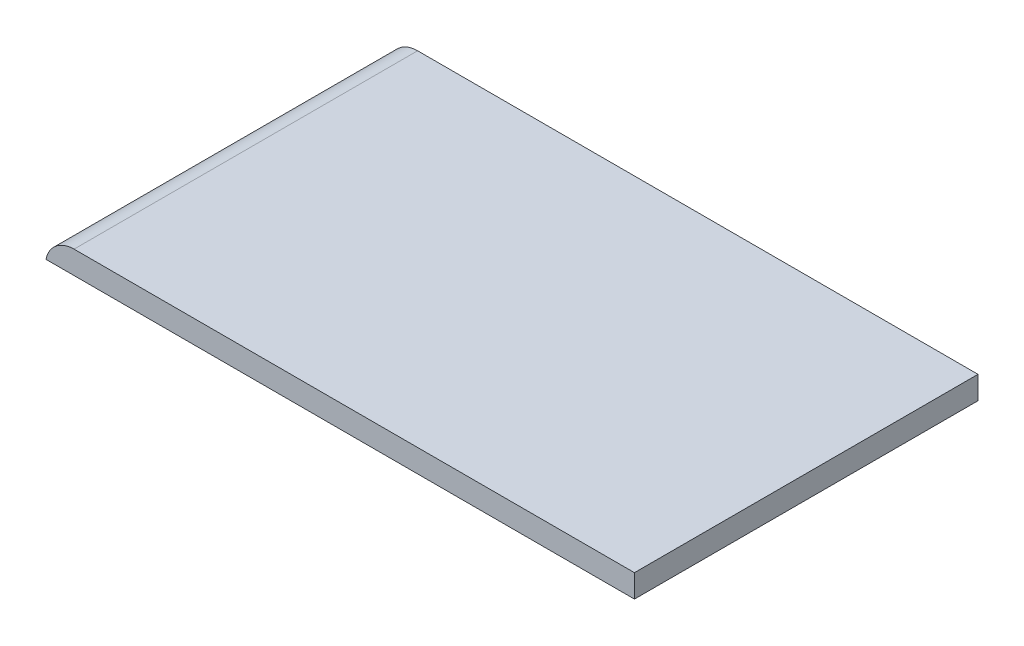
ISO-10303-21;
HEADER;
FILE_DESCRIPTION(('STEP AP214'),'2;1');
FILE_NAME('part.step','',(''),(''),'','','');
FILE_SCHEMA(('AUTOMOTIVE_DESIGN { 1 0 10303 214 1 1 1 1 }'));
ENDSEC;
DATA;
#1=APPLICATION_CONTEXT('core data for automotive mechanical design processes');
#2=APPLICATION_PROTOCOL_DEFINITION('international standard','automotive_design',2000,#1);
#3=PRODUCT_CONTEXT('',#1,'mechanical');
#4=PRODUCT('Part','Part','',(#3));
#5=PRODUCT_RELATED_PRODUCT_CATEGORY('part','',(#4));
#6=PRODUCT_DEFINITION_FORMATION('','',#4);
#7=PRODUCT_DEFINITION_CONTEXT('part definition',#1,'design');
#8=PRODUCT_DEFINITION('design','',#6,#7);
#9=PRODUCT_DEFINITION_SHAPE('','',#8);
#10=(LENGTH_UNIT() NAMED_UNIT(*) SI_UNIT(.MILLI.,.METRE.));
#11=(NAMED_UNIT(*) PLANE_ANGLE_UNIT() SI_UNIT($,.RADIAN.));
#12=(NAMED_UNIT(*) SI_UNIT($,.STERADIAN.) SOLID_ANGLE_UNIT());
#13=UNCERTAINTY_MEASURE_WITH_UNIT(LENGTH_MEASURE(1.E-05),#10,'distance_accuracy_value','');
#14=(GEOMETRIC_REPRESENTATION_CONTEXT(3) GLOBAL_UNCERTAINTY_ASSIGNED_CONTEXT((#13)) GLOBAL_UNIT_ASSIGNED_CONTEXT((#10,
#11,#12)) REPRESENTATION_CONTEXT('',''));
#15=CARTESIAN_POINT('',(0.,0.,0.));
#16=DIRECTION('',(0.,0.,1.));
#17=DIRECTION('',(1.,0.,0.));
#18=AXIS2_PLACEMENT_3D('',#15,#16,#17);
#19=CARTESIAN_POINT('',(-61.9900976212472,1.99999999999999,49.4977928341633));
#20=DIRECTION('',(0.,0.,-1.));
#21=DIRECTION('',(-1.,0.,0.));
#22=AXIS2_PLACEMENT_3D('',#19,#20,#21);
#23=PLANE('',#22);
#24=DIRECTION('',(1.,0.,0.));
#25=VECTOR('',#24,1.);
#26=CARTESIAN_POINT('',(-61.9900976212472,1.99999999999999,49.4977928341633));
#27=LINE('',#26,#25);
#28=CARTESIAN_POINT('',(-59.540607878464,1.99999999999999,49.4977928341633));
#29=VERTEX_POINT('',#28);
#30=CARTESIAN_POINT('',(-10.6067408444631,2.00000000000001,49.4977928341633));
#31=VERTEX_POINT('',#30);
#32=EDGE_CURVE('E74',#29,#31,#27,.T.);
#33=ORIENTED_EDGE('',*,*,#32,.F.);
#34=CARTESIAN_POINT('',(-59.540607878464,-0.500000000000042,49.4977928341632));
#35=DIRECTION('',(0.,0.,-1.));
#36=DIRECTION('',(-1.,0.,0.));
#37=AXIS2_PLACEMENT_3D('',#34,#35,#36);
#38=CIRCLE('',#37,2.5);
#39=CARTESIAN_POINT('',(-61.9900976212471,0.,49.4977928341633));
#40=VERTEX_POINT('',#39);
#41=EDGE_CURVE('E43',#29,#40,#38,.F.);
#42=ORIENTED_EDGE('',*,*,#41,.T.);
#43=DIRECTION('',(1.,0.,0.));
#44=VECTOR('',#43,1.);
#45=CARTESIAN_POINT('',(-61.9900976212471,0.,49.4977928341633));
#46=LINE('',#45,#44);
#47=CARTESIAN_POINT('',(-10.6067408444631,0.,49.4977928341632));
#48=VERTEX_POINT('',#47);
#49=EDGE_CURVE('E87',#40,#48,#46,.T.);
#50=ORIENTED_EDGE('',*,*,#49,.T.);
#51=DIRECTION('',(0.,-1.,0.));
#52=VECTOR('',#51,1.);
#53=CARTESIAN_POINT('',(-10.6067408444631,2.00000000000001,49.4977928341633));
#54=LINE('',#53,#52);
#55=EDGE_CURVE('E85',#31,#48,#54,.T.);
#56=ORIENTED_EDGE('',*,*,#55,.F.);
#57=EDGE_LOOP('',(#33,#42,#50,#56));
#58=FACE_BOUND('',#57,.T.);
#59=ADVANCED_FACE('F35',(#58),#23,.F.);
#60=CARTESIAN_POINT('',(-10.6067408444631,2.00000000000001,49.4977928341633));
#61=DIRECTION('',(-1.,0.,0.));
#62=DIRECTION('',(0.,0.,1.));
#63=AXIS2_PLACEMENT_3D('',#60,#61,#62);
#64=PLANE('',#63);
#65=DIRECTION('',(0.,0.,-1.));
#66=VECTOR('',#65,1.);
#67=CARTESIAN_POINT('',(-10.6067408444631,0.,49.4977928341632));
#68=LINE('',#67,#66);
#69=CARTESIAN_POINT('',(-10.6067408444631,0.,19.4977928341632));
#70=VERTEX_POINT('',#69);
#71=EDGE_CURVE('E101',#48,#70,#68,.T.);
#72=ORIENTED_EDGE('',*,*,#71,.T.);
#73=DIRECTION('',(0.,-1.,0.));
#74=VECTOR('',#73,1.);
#75=CARTESIAN_POINT('',(-10.6067408444631,2.,19.4977928341632));
#76=LINE('',#75,#74);
#77=CARTESIAN_POINT('',(-10.6067408444631,2.,19.4977928341632));
#78=VERTEX_POINT('',#77);
#79=EDGE_CURVE('E90',#78,#70,#76,.T.);
#80=ORIENTED_EDGE('',*,*,#79,.F.);
#81=DIRECTION('',(0.,0.,-1.));
#82=VECTOR('',#81,1.);
#83=CARTESIAN_POINT('',(-10.6067408444631,2.00000000000001,49.4977928341633));
#84=LINE('',#83,#82);
#85=EDGE_CURVE('E78',#31,#78,#84,.T.);
#86=ORIENTED_EDGE('',*,*,#85,.F.);
#87=ORIENTED_EDGE('',*,*,#55,.T.);
#88=EDGE_LOOP('',(#72,#80,#86,#87));
#89=FACE_BOUND('',#88,.T.);
#90=ADVANCED_FACE('F92',(#89),#64,.F.);
#91=CARTESIAN_POINT('',(-61.9900976212471,2.,19.4977928341633));
#92=DIRECTION('',(0.,0.,1.));
#93=DIRECTION('',(1.,0.,0.));
#94=AXIS2_PLACEMENT_3D('',#91,#92,#93);
#95=PLANE('',#94);
#96=DIRECTION('',(-1.,0.,0.));
#97=VECTOR('',#96,1.);
#98=CARTESIAN_POINT('',(-61.9900976212471,0.,19.4977928341633));
#99=LINE('',#98,#97);
#100=CARTESIAN_POINT('',(-61.9900976212471,0.,19.4977928341633));
#101=VERTEX_POINT('',#100);
#102=EDGE_CURVE('E82',#70,#101,#99,.T.);
#103=ORIENTED_EDGE('',*,*,#102,.T.);
#104=CARTESIAN_POINT('',(-59.5406078784639,-0.500000000000049,19.4977928341632));
#105=DIRECTION('',(0.,0.,1.));
#106=DIRECTION('',(1.,0.,0.));
#107=AXIS2_PLACEMENT_3D('',#104,#105,#106);
#108=CIRCLE('',#107,2.5);
#109=CARTESIAN_POINT('',(-59.5406078784639,2.,19.4977928341632));
#110=VERTEX_POINT('',#109);
#111=EDGE_CURVE('E11',#101,#110,#108,.F.);
#112=ORIENTED_EDGE('',*,*,#111,.T.);
#113=DIRECTION('',(-1.,0.,0.));
#114=VECTOR('',#113,1.);
#115=CARTESIAN_POINT('',(-61.9900976212471,2.,19.4977928341633));
#116=LINE('',#115,#114);
#117=EDGE_CURVE('E94',#78,#110,#116,.T.);
#118=ORIENTED_EDGE('',*,*,#117,.F.);
#119=ORIENTED_EDGE('',*,*,#79,.T.);
#120=EDGE_LOOP('',(#103,#112,#118,#119));
#121=FACE_BOUND('',#120,.T.);
#122=ADVANCED_FACE('F118',(#121),#95,.F.);
#123=CARTESIAN_POINT('',(0.,2.,0.));
#124=DIRECTION('',(0.,-1.,0.));
#125=DIRECTION('',(0.,0.,-1.));
#126=AXIS2_PLACEMENT_3D('',#123,#124,#125);
#127=PLANE('',#126);
#128=ORIENTED_EDGE('',*,*,#117,.T.);
#129=DIRECTION('',(0.,0.,-1.));
#130=VECTOR('',#129,1.);
#131=CARTESIAN_POINT('',(-59.540607878464,1.99999999999999,0.));
#132=LINE('',#131,#130);
#133=EDGE_CURVE('E80',#110,#29,#132,.F.);
#134=ORIENTED_EDGE('',*,*,#133,.T.);
#135=ORIENTED_EDGE('',*,*,#32,.T.);
#136=ORIENTED_EDGE('',*,*,#85,.T.);
#137=EDGE_LOOP('',(#128,#134,#135,#136));
#138=FACE_BOUND('',#137,.T.);
#139=ADVANCED_FACE('F76',(#138),#127,.F.);
#140=CARTESIAN_POINT('',(0.,0.,0.));
#141=DIRECTION('',(0.,-1.,0.));
#142=DIRECTION('',(0.,0.,-1.));
#143=AXIS2_PLACEMENT_3D('',#140,#141,#142);
#144=PLANE('',#143);
#145=DIRECTION('',(0.,0.,1.));
#146=VECTOR('',#145,1.);
#147=CARTESIAN_POINT('',(-61.9900976212471,0.,49.4977928341633));
#148=LINE('',#147,#146);
#149=EDGE_CURVE('E98',#101,#40,#148,.T.);
#150=ORIENTED_EDGE('',*,*,#149,.F.);
#151=ORIENTED_EDGE('',*,*,#102,.F.);
#152=ORIENTED_EDGE('',*,*,#71,.F.);
#153=ORIENTED_EDGE('',*,*,#49,.F.);
#154=EDGE_LOOP('',(#150,#151,#152,#153));
#155=FACE_BOUND('',#154,.T.);
#156=ADVANCED_FACE('F107',(#155),#144,.T.);
#157=CARTESIAN_POINT('',(-59.540607878464,-0.500000000000042,49.4977928341632));
#158=DIRECTION('',(0.,0.,-1.));
#159=DIRECTION('',(-1.,0.,0.));
#160=AXIS2_PLACEMENT_3D('',#157,#158,#159);
#161=CYLINDRICAL_SURFACE('',#160,2.5);
#162=ORIENTED_EDGE('',*,*,#111,.F.);
#163=ORIENTED_EDGE('',*,*,#149,.T.);
#164=ORIENTED_EDGE('',*,*,#41,.F.);
#165=ORIENTED_EDGE('',*,*,#133,.F.);
#166=EDGE_LOOP('',(#162,#163,#164,#165));
#167=FACE_BOUND('',#166,.T.);
#168=ADVANCED_FACE('F37',(#167),#161,.T.);
#169=CLOSED_SHELL('',(#59,#90,#122,#139,#156,#168));
#170=MANIFOLD_SOLID_BREP('B2',#169);
#171=ADVANCED_BREP_SHAPE_REPRESENTATION('',(#18,#170),#14);
#172=SHAPE_DEFINITION_REPRESENTATION(#9,#171);
ENDSEC;
END-ISO-10303-21;
